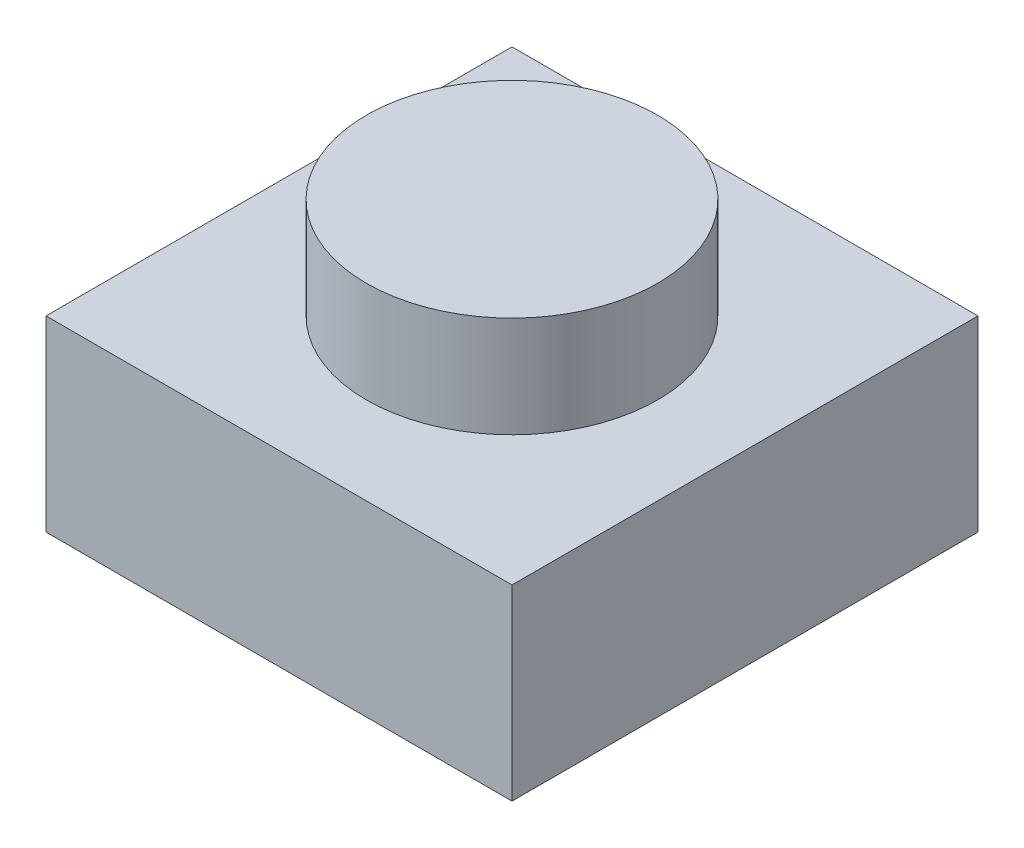
ISO-10303-21;
HEADER;
FILE_DESCRIPTION(('STEP AP214'),'2;1');
FILE_NAME('part.step','',(''),(''),'','','');
FILE_SCHEMA(('AUTOMOTIVE_DESIGN { 1 0 10303 214 1 1 1 1 }'));
ENDSEC;
DATA;
#1=APPLICATION_CONTEXT('core data for automotive mechanical design processes');
#2=APPLICATION_PROTOCOL_DEFINITION('international standard','automotive_design',2000,#1);
#3=PRODUCT_CONTEXT('',#1,'mechanical');
#4=PRODUCT('Part','Part','',(#3));
#5=PRODUCT_RELATED_PRODUCT_CATEGORY('part','',(#4));
#6=PRODUCT_DEFINITION_FORMATION('','',#4);
#7=PRODUCT_DEFINITION_CONTEXT('part definition',#1,'design');
#8=PRODUCT_DEFINITION('design','',#6,#7);
#9=PRODUCT_DEFINITION_SHAPE('','',#8);
#10=(LENGTH_UNIT() NAMED_UNIT(*) SI_UNIT(.MILLI.,.METRE.));
#11=(NAMED_UNIT(*) PLANE_ANGLE_UNIT() SI_UNIT($,.RADIAN.));
#12=(NAMED_UNIT(*) SI_UNIT($,.STERADIAN.) SOLID_ANGLE_UNIT());
#13=UNCERTAINTY_MEASURE_WITH_UNIT(LENGTH_MEASURE(1.E-05),#10,'distance_accuracy_value','');
#14=(GEOMETRIC_REPRESENTATION_CONTEXT(3) GLOBAL_UNCERTAINTY_ASSIGNED_CONTEXT((#13)) GLOBAL_UNIT_ASSIGNED_CONTEXT((#10,
#11,#12)) REPRESENTATION_CONTEXT('',''));
#15=CARTESIAN_POINT('',(0.,0.,0.));
#16=DIRECTION('',(0.,0.,1.));
#17=DIRECTION('',(1.,0.,0.));
#18=AXIS2_PLACEMENT_3D('',#15,#16,#17);
#19=CARTESIAN_POINT('',(3.92,-3.15,-3.92));
#20=DIRECTION('',(1.,0.,0.));
#21=DIRECTION('',(0.,0.,-1.));
#22=AXIS2_PLACEMENT_3D('',#19,#20,#21);
#23=PLANE('',#22);
#24=DIRECTION('',(0.,0.,-1.));
#25=VECTOR('',#24,1.);
#26=CARTESIAN_POINT('',(3.92,0.,-3.92));
#27=LINE('',#26,#25);
#28=CARTESIAN_POINT('',(3.92,0.,3.92));
#29=VERTEX_POINT('',#28);
#30=CARTESIAN_POINT('',(3.92,0.,-3.92));
#31=VERTEX_POINT('',#30);
#32=EDGE_CURVE('E153',#29,#31,#27,.T.);
#33=ORIENTED_EDGE('',*,*,#32,.F.);
#34=DIRECTION('',(0.,1.,0.));
#35=VECTOR('',#34,1.);
#36=CARTESIAN_POINT('',(3.92,-3.15,3.92));
#37=LINE('',#36,#35);
#38=CARTESIAN_POINT('',(3.92,-3.15,3.92));
#39=VERTEX_POINT('',#38);
#40=EDGE_CURVE('E40',#39,#29,#37,.T.);
#41=ORIENTED_EDGE('',*,*,#40,.F.);
#42=DIRECTION('',(0.,0.,-1.));
#43=VECTOR('',#42,1.);
#44=CARTESIAN_POINT('',(3.92,-3.15,-3.92));
#45=LINE('',#44,#43);
#46=CARTESIAN_POINT('',(3.92,-3.15,-3.92));
#47=VERTEX_POINT('',#46);
#48=EDGE_CURVE('E155',#39,#47,#45,.T.);
#49=ORIENTED_EDGE('',*,*,#48,.T.);
#50=DIRECTION('',(0.,1.,0.));
#51=VECTOR('',#50,1.);
#52=CARTESIAN_POINT('',(3.92,-3.15,-3.92));
#53=LINE('',#52,#51);
#54=EDGE_CURVE('E35',#47,#31,#53,.T.);
#55=ORIENTED_EDGE('',*,*,#54,.T.);
#56=EDGE_LOOP('',(#33,#41,#49,#55));
#57=FACE_BOUND('',#56,.T.);
#58=ADVANCED_FACE('F32',(#57),#23,.T.);
#59=CARTESIAN_POINT('',(-3.92,-3.15,3.92));
#60=DIRECTION('',(0.,0.,1.));
#61=DIRECTION('',(1.,0.,0.));
#62=AXIS2_PLACEMENT_3D('',#59,#60,#61);
#63=PLANE('',#62);
#64=DIRECTION('',(1.,0.,0.));
#65=VECTOR('',#64,1.);
#66=CARTESIAN_POINT('',(-3.92,0.,3.92));
#67=LINE('',#66,#65);
#68=CARTESIAN_POINT('',(-3.92,0.,3.92));
#69=VERTEX_POINT('',#68);
#70=EDGE_CURVE('E158',#69,#29,#67,.T.);
#71=ORIENTED_EDGE('',*,*,#70,.F.);
#72=DIRECTION('',(0.,1.,0.));
#73=VECTOR('',#72,1.);
#74=CARTESIAN_POINT('',(-3.92,-3.15,3.92));
#75=LINE('',#74,#73);
#76=CARTESIAN_POINT('',(-3.92,-3.15,3.92));
#77=VERTEX_POINT('',#76);
#78=EDGE_CURVE('E176',#77,#69,#75,.T.);
#79=ORIENTED_EDGE('',*,*,#78,.F.);
#80=DIRECTION('',(1.,0.,0.));
#81=VECTOR('',#80,1.);
#82=CARTESIAN_POINT('',(-3.92,-3.15,3.92));
#83=LINE('',#82,#81);
#84=EDGE_CURVE('E163',#77,#39,#83,.T.);
#85=ORIENTED_EDGE('',*,*,#84,.T.);
#86=ORIENTED_EDGE('',*,*,#40,.T.);
#87=EDGE_LOOP('',(#71,#79,#85,#86));
#88=FACE_BOUND('',#87,.T.);
#89=ADVANCED_FACE('F182',(#88),#63,.T.);
#90=CARTESIAN_POINT('',(-3.92,-3.15,-3.92));
#91=DIRECTION('',(-1.,0.,0.));
#92=DIRECTION('',(0.,0.,1.));
#93=AXIS2_PLACEMENT_3D('',#90,#91,#92);
#94=PLANE('',#93);
#95=DIRECTION('',(0.,0.,1.));
#96=VECTOR('',#95,1.);
#97=CARTESIAN_POINT('',(-3.92,0.,-3.92));
#98=LINE('',#97,#96);
#99=CARTESIAN_POINT('',(-3.92,0.,-3.92));
#100=VERTEX_POINT('',#99);
#101=EDGE_CURVE('E170',#100,#69,#98,.T.);
#102=ORIENTED_EDGE('',*,*,#101,.F.);
#103=DIRECTION('',(0.,1.,0.));
#104=VECTOR('',#103,1.);
#105=CARTESIAN_POINT('',(-3.92,-3.15,-3.92));
#106=LINE('',#105,#104);
#107=CARTESIAN_POINT('',(-3.92,-3.15,-3.92));
#108=VERTEX_POINT('',#107);
#109=EDGE_CURVE('E177',#108,#100,#106,.T.);
#110=ORIENTED_EDGE('',*,*,#109,.F.);
#111=DIRECTION('',(0.,0.,1.));
#112=VECTOR('',#111,1.);
#113=CARTESIAN_POINT('',(-3.92,-3.15,-3.92));
#114=LINE('',#113,#112);
#115=EDGE_CURVE('E160',#108,#77,#114,.T.);
#116=ORIENTED_EDGE('',*,*,#115,.T.);
#117=ORIENTED_EDGE('',*,*,#78,.T.);
#118=EDGE_LOOP('',(#102,#110,#116,#117));
#119=FACE_BOUND('',#118,.T.);
#120=ADVANCED_FACE('F186',(#119),#94,.T.);
#121=CARTESIAN_POINT('',(-3.92,-3.15,-3.92));
#122=DIRECTION('',(0.,0.,-1.));
#123=DIRECTION('',(-1.,0.,0.));
#124=AXIS2_PLACEMENT_3D('',#121,#122,#123);
#125=PLANE('',#124);
#126=DIRECTION('',(-1.,0.,0.));
#127=VECTOR('',#126,1.);
#128=CARTESIAN_POINT('',(-3.92,0.,-3.92));
#129=LINE('',#128,#127);
#130=EDGE_CURVE('E167',#31,#100,#129,.T.);
#131=ORIENTED_EDGE('',*,*,#130,.F.);
#132=ORIENTED_EDGE('',*,*,#54,.F.);
#133=DIRECTION('',(-1.,0.,0.));
#134=VECTOR('',#133,1.);
#135=CARTESIAN_POINT('',(-3.92,-3.15,-3.92));
#136=LINE('',#135,#134);
#137=EDGE_CURVE('E157',#47,#108,#136,.T.);
#138=ORIENTED_EDGE('',*,*,#137,.T.);
#139=ORIENTED_EDGE('',*,*,#109,.T.);
#140=EDGE_LOOP('',(#131,#132,#138,#139));
#141=FACE_BOUND('',#140,.T.);
#142=ADVANCED_FACE('F179',(#141),#125,.T.);
#143=CARTESIAN_POINT('',(0.,-3.15,0.));
#144=DIRECTION('',(0.,1.,0.));
#145=DIRECTION('',(0.,0.,1.));
#146=AXIS2_PLACEMENT_3D('',#143,#144,#145);
#147=PLANE('',#146);
#148=DIRECTION('',(1.,0.,0.));
#149=VECTOR('',#148,1.);
#150=CARTESIAN_POINT('',(0.,-3.15,2.42));
#151=LINE('',#150,#149);
#152=CARTESIAN_POINT('',(-2.42,-3.15,2.42));
#153=VERTEX_POINT('',#152);
#154=CARTESIAN_POINT('',(2.42,-3.15,2.42));
#155=VERTEX_POINT('',#154);
#156=EDGE_CURVE('E147',#153,#155,#151,.T.);
#157=ORIENTED_EDGE('',*,*,#156,.T.);
#158=DIRECTION('',(0.,0.,-1.));
#159=VECTOR('',#158,1.);
#160=CARTESIAN_POINT('',(2.42,-3.15,0.));
#161=LINE('',#160,#159);
#162=CARTESIAN_POINT('',(2.42,-3.15,-2.42));
#163=VERTEX_POINT('',#162);
#164=EDGE_CURVE('E110',#155,#163,#161,.T.);
#165=ORIENTED_EDGE('',*,*,#164,.T.);
#166=DIRECTION('',(-1.,0.,0.));
#167=VECTOR('',#166,1.);
#168=CARTESIAN_POINT('',(0.,-3.15,-2.42));
#169=LINE('',#168,#167);
#170=CARTESIAN_POINT('',(-2.42,-3.15,-2.42));
#171=VERTEX_POINT('',#170);
#172=EDGE_CURVE('E132',#163,#171,#169,.T.);
#173=ORIENTED_EDGE('',*,*,#172,.T.);
#174=DIRECTION('',(0.,0.,1.));
#175=VECTOR('',#174,1.);
#176=CARTESIAN_POINT('',(-2.42,-3.15,0.));
#177=LINE('',#176,#175);
#178=EDGE_CURVE('E48',#171,#153,#177,.T.);
#179=ORIENTED_EDGE('',*,*,#178,.T.);
#180=EDGE_LOOP('',(#157,#165,#173,#179));
#181=FACE_BOUND('',#180,.T.);
#182=ORIENTED_EDGE('',*,*,#48,.F.);
#183=ORIENTED_EDGE('',*,*,#84,.F.);
#184=ORIENTED_EDGE('',*,*,#115,.F.);
#185=ORIENTED_EDGE('',*,*,#137,.F.);
#186=EDGE_LOOP('',(#182,#183,#184,#185));
#187=FACE_BOUND('',#186,.T.);
#188=ADVANCED_FACE('F188',(#181,#187),#147,.F.);
#189=CARTESIAN_POINT('',(0.,0.,0.));
#190=DIRECTION('',(0.,1.,0.));
#191=DIRECTION('',(0.,0.,1.));
#192=AXIS2_PLACEMENT_3D('',#189,#190,#191);
#193=PLANE('',#192);
#194=CARTESIAN_POINT('',(0.,0.,0.));
#195=DIRECTION('',(0.,1.,0.));
#196=DIRECTION('',(0.,0.,1.));
#197=AXIS2_PLACEMENT_3D('',#194,#195,#196);
#198=CIRCLE('',#197,2.45);
#199=CARTESIAN_POINT('',(0.,0.,2.45));
#200=VERTEX_POINT('',#199);
#201=EDGE_CURVE('E11',#200,#200,#198,.T.);
#202=ORIENTED_EDGE('',*,*,#201,.F.);
#203=EDGE_LOOP('',(#202));
#204=FACE_BOUND('',#203,.T.);
#205=ORIENTED_EDGE('',*,*,#32,.T.);
#206=ORIENTED_EDGE('',*,*,#130,.T.);
#207=ORIENTED_EDGE('',*,*,#101,.T.);
#208=ORIENTED_EDGE('',*,*,#70,.T.);
#209=EDGE_LOOP('',(#205,#206,#207,#208));
#210=FACE_BOUND('',#209,.T.);
#211=ADVANCED_FACE('F181',(#204,#210),#193,.T.);
#212=CARTESIAN_POINT('',(0.,1.7,0.));
#213=DIRECTION('',(0.,-1.,0.));
#214=DIRECTION('',(0.,0.,-1.));
#215=AXIS2_PLACEMENT_3D('',#212,#213,#214);
#216=CYLINDRICAL_SURFACE('',#215,2.45);
#217=CARTESIAN_POINT('',(0.,1.7,0.));
#218=DIRECTION('',(0.,1.,0.));
#219=DIRECTION('',(0.,0.,1.));
#220=AXIS2_PLACEMENT_3D('',#217,#218,#219);
#221=CIRCLE('',#220,2.45);
#222=CARTESIAN_POINT('',(0.,1.7,2.45));
#223=VERTEX_POINT('',#222);
#224=EDGE_CURVE('E144',#223,#223,#221,.T.);
#225=ORIENTED_EDGE('',*,*,#224,.F.);
#226=EDGE_LOOP('',(#225));
#227=FACE_BOUND('',#226,.T.);
#228=ORIENTED_EDGE('',*,*,#201,.T.);
#229=EDGE_LOOP('',(#228));
#230=FACE_BOUND('',#229,.T.);
#231=ADVANCED_FACE('F196',(#227,#230),#216,.T.);
#232=CARTESIAN_POINT('',(0.,1.7,0.));
#233=DIRECTION('',(0.,1.,0.));
#234=DIRECTION('',(0.,0.,1.));
#235=AXIS2_PLACEMENT_3D('',#232,#233,#234);
#236=PLANE('',#235);
#237=ORIENTED_EDGE('',*,*,#224,.T.);
#238=EDGE_LOOP('',(#237));
#239=FACE_BOUND('',#238,.T.);
#240=ADVANCED_FACE('F231',(#239),#236,.T.);
#241=CARTESIAN_POINT('',(2.42,-3.15,-3.92));
#242=DIRECTION('',(1.,0.,0.));
#243=DIRECTION('',(0.,0.,-1.));
#244=AXIS2_PLACEMENT_3D('',#241,#242,#243);
#245=PLANE('',#244);
#246=DIRECTION('',(0.,0.,-1.));
#247=VECTOR('',#246,1.);
#248=CARTESIAN_POINT('',(2.42,-1.5,0.));
#249=LINE('',#248,#247);
#250=CARTESIAN_POINT('',(2.42,-1.5,2.42));
#251=VERTEX_POINT('',#250);
#252=CARTESIAN_POINT('',(2.42,-1.5,-2.42));
#253=VERTEX_POINT('',#252);
#254=EDGE_CURVE('E108',#251,#253,#249,.T.);
#255=ORIENTED_EDGE('',*,*,#254,.T.);
#256=DIRECTION('',(0.,1.,0.));
#257=VECTOR('',#256,1.);
#258=CARTESIAN_POINT('',(2.42,-3.15,-2.42));
#259=LINE('',#258,#257);
#260=EDGE_CURVE('E137',#163,#253,#259,.T.);
#261=ORIENTED_EDGE('',*,*,#260,.F.);
#262=ORIENTED_EDGE('',*,*,#164,.F.);
#263=DIRECTION('',(0.,1.,0.));
#264=VECTOR('',#263,1.);
#265=CARTESIAN_POINT('',(2.42,-3.15,2.42));
#266=LINE('',#265,#264);
#267=EDGE_CURVE('E105',#155,#251,#266,.T.);
#268=ORIENTED_EDGE('',*,*,#267,.T.);
#269=EDGE_LOOP('',(#255,#261,#262,#268));
#270=FACE_BOUND('',#269,.T.);
#271=ADVANCED_FACE('F107',(#270),#245,.F.);
#272=CARTESIAN_POINT('',(-3.92,-3.15,2.42));
#273=DIRECTION('',(0.,0.,1.));
#274=DIRECTION('',(1.,0.,0.));
#275=AXIS2_PLACEMENT_3D('',#272,#273,#274);
#276=PLANE('',#275);
#277=DIRECTION('',(1.,0.,0.));
#278=VECTOR('',#277,1.);
#279=CARTESIAN_POINT('',(0.,-1.5,2.42));
#280=LINE('',#279,#278);
#281=CARTESIAN_POINT('',(-2.42,-1.5,2.42));
#282=VERTEX_POINT('',#281);
#283=EDGE_CURVE('E123',#282,#251,#280,.T.);
#284=ORIENTED_EDGE('',*,*,#283,.T.);
#285=ORIENTED_EDGE('',*,*,#267,.F.);
#286=ORIENTED_EDGE('',*,*,#156,.F.);
#287=DIRECTION('',(0.,1.,0.));
#288=VECTOR('',#287,1.);
#289=CARTESIAN_POINT('',(-2.42,-3.15,2.42));
#290=LINE('',#289,#288);
#291=EDGE_CURVE('E116',#153,#282,#290,.T.);
#292=ORIENTED_EDGE('',*,*,#291,.T.);
#293=EDGE_LOOP('',(#284,#285,#286,#292));
#294=FACE_BOUND('',#293,.T.);
#295=ADVANCED_FACE('F128',(#294),#276,.F.);
#296=CARTESIAN_POINT('',(-2.42,-3.15,-3.92));
#297=DIRECTION('',(-1.,0.,0.));
#298=DIRECTION('',(0.,0.,1.));
#299=AXIS2_PLACEMENT_3D('',#296,#297,#298);
#300=PLANE('',#299);
#301=DIRECTION('',(0.,0.,1.));
#302=VECTOR('',#301,1.);
#303=CARTESIAN_POINT('',(-2.42,-1.5,0.));
#304=LINE('',#303,#302);
#305=CARTESIAN_POINT('',(-2.42,-1.5,-2.42));
#306=VERTEX_POINT('',#305);
#307=EDGE_CURVE('E130',#306,#282,#304,.T.);
#308=ORIENTED_EDGE('',*,*,#307,.T.);
#309=ORIENTED_EDGE('',*,*,#291,.F.);
#310=ORIENTED_EDGE('',*,*,#178,.F.);
#311=DIRECTION('',(0.,1.,0.));
#312=VECTOR('',#311,1.);
#313=CARTESIAN_POINT('',(-2.42,-3.15,-2.42));
#314=LINE('',#313,#312);
#315=EDGE_CURVE('E138',#171,#306,#314,.T.);
#316=ORIENTED_EDGE('',*,*,#315,.T.);
#317=EDGE_LOOP('',(#308,#309,#310,#316));
#318=FACE_BOUND('',#317,.T.);
#319=ADVANCED_FACE('F260',(#318),#300,.F.);
#320=CARTESIAN_POINT('',(-3.92,-3.15,-2.42));
#321=DIRECTION('',(0.,0.,-1.));
#322=DIRECTION('',(-1.,0.,0.));
#323=AXIS2_PLACEMENT_3D('',#320,#321,#322);
#324=PLANE('',#323);
#325=DIRECTION('',(-1.,0.,0.));
#326=VECTOR('',#325,1.);
#327=CARTESIAN_POINT('',(0.,-1.5,-2.42));
#328=LINE('',#327,#326);
#329=EDGE_CURVE('E125',#253,#306,#328,.T.);
#330=ORIENTED_EDGE('',*,*,#329,.T.);
#331=ORIENTED_EDGE('',*,*,#315,.F.);
#332=ORIENTED_EDGE('',*,*,#172,.F.);
#333=ORIENTED_EDGE('',*,*,#260,.T.);
#334=EDGE_LOOP('',(#330,#331,#332,#333));
#335=FACE_BOUND('',#334,.T.);
#336=ADVANCED_FACE('F269',(#335),#324,.F.);
#337=CARTESIAN_POINT('',(0.,-1.5,0.));
#338=DIRECTION('',(0.,1.,0.));
#339=DIRECTION('',(0.,0.,1.));
#340=AXIS2_PLACEMENT_3D('',#337,#338,#339);
#341=PLANE('',#340);
#342=CARTESIAN_POINT('',(0.,-1.5,0.));
#343=DIRECTION('',(0.,1.,0.));
#344=DIRECTION('',(0.,0.,1.));
#345=AXIS2_PLACEMENT_3D('',#342,#343,#344);
#346=CIRCLE('',#345,0.950000000000001);
#347=CARTESIAN_POINT('',(0.,-1.5,0.950000000000001));
#348=VERTEX_POINT('',#347);
#349=EDGE_CURVE('E115',#348,#348,#346,.T.);
#350=ORIENTED_EDGE('',*,*,#349,.T.);
#351=EDGE_LOOP('',(#350));
#352=FACE_BOUND('',#351,.T.);
#353=ORIENTED_EDGE('',*,*,#254,.F.);
#354=ORIENTED_EDGE('',*,*,#283,.F.);
#355=ORIENTED_EDGE('',*,*,#307,.F.);
#356=ORIENTED_EDGE('',*,*,#329,.F.);
#357=EDGE_LOOP('',(#353,#354,#355,#356));
#358=FACE_BOUND('',#357,.T.);
#359=ADVANCED_FACE('F121',(#352,#358),#341,.F.);
#360=CARTESIAN_POINT('',(0.,1.7,0.));
#361=DIRECTION('',(0.,-1.,0.));
#362=DIRECTION('',(0.,0.,-1.));
#363=AXIS2_PLACEMENT_3D('',#360,#361,#362);
#364=CYLINDRICAL_SURFACE('',#363,0.950000000000001);
#365=CARTESIAN_POINT('',(0.,0.2,0.));
#366=DIRECTION('',(0.,1.,0.));
#367=DIRECTION('',(0.,0.,1.));
#368=AXIS2_PLACEMENT_3D('',#365,#366,#367);
#369=CIRCLE('',#368,0.950000000000001);
#370=CARTESIAN_POINT('',(0.,0.2,0.950000000000001));
#371=VERTEX_POINT('',#370);
#372=EDGE_CURVE('E126',#371,#371,#369,.T.);
#373=ORIENTED_EDGE('',*,*,#372,.T.);
#374=EDGE_LOOP('',(#373));
#375=FACE_BOUND('',#374,.T.);
#376=ORIENTED_EDGE('',*,*,#349,.F.);
#377=EDGE_LOOP('',(#376));
#378=FACE_BOUND('',#377,.T.);
#379=ADVANCED_FACE('F287',(#375,#378),#364,.F.);
#380=CARTESIAN_POINT('',(0.,0.2,0.));
#381=DIRECTION('',(0.,1.,0.));
#382=DIRECTION('',(0.,0.,1.));
#383=AXIS2_PLACEMENT_3D('',#380,#381,#382);
#384=PLANE('',#383);
#385=ORIENTED_EDGE('',*,*,#372,.F.);
#386=EDGE_LOOP('',(#385));
#387=FACE_BOUND('',#386,.T.);
#388=ADVANCED_FACE('F297',(#387),#384,.F.);
#389=CLOSED_SHELL('',(#58,#89,#120,#142,#188,#211,#231,#240,#271,#295,#319,#336,#359,#379,#388));
#390=MANIFOLD_SOLID_BREP('B2',#389);
#391=ADVANCED_BREP_SHAPE_REPRESENTATION('',(#18,#390),#14);
#392=SHAPE_DEFINITION_REPRESENTATION(#9,#391);
ENDSEC;
END-ISO-10303-21;
